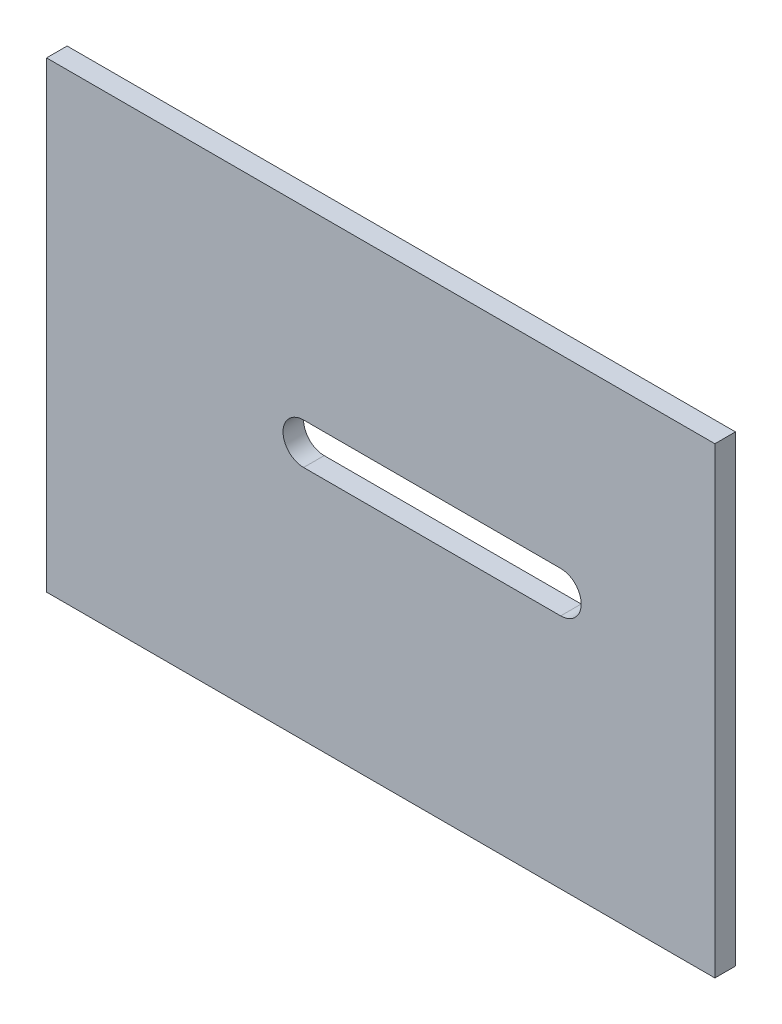
ISO-10303-21;
HEADER;
FILE_DESCRIPTION(('STEP AP214'),'2;1');
FILE_NAME('part.step','',(''),(''),'','','');
FILE_SCHEMA(('AUTOMOTIVE_DESIGN { 1 0 10303 214 1 1 1 1 }'));
ENDSEC;
DATA;
#1=APPLICATION_CONTEXT('core data for automotive mechanical design processes');
#2=APPLICATION_PROTOCOL_DEFINITION('international standard','automotive_design',2000,#1);
#3=PRODUCT_CONTEXT('',#1,'mechanical');
#4=PRODUCT('Part','Part','',(#3));
#5=PRODUCT_RELATED_PRODUCT_CATEGORY('part','',(#4));
#6=PRODUCT_DEFINITION_FORMATION('','',#4);
#7=PRODUCT_DEFINITION_CONTEXT('part definition',#1,'design');
#8=PRODUCT_DEFINITION('design','',#6,#7);
#9=PRODUCT_DEFINITION_SHAPE('','',#8);
#10=(LENGTH_UNIT() NAMED_UNIT(*) SI_UNIT(.MILLI.,.METRE.));
#11=(NAMED_UNIT(*) PLANE_ANGLE_UNIT() SI_UNIT($,.RADIAN.));
#12=(NAMED_UNIT(*) SI_UNIT($,.STERADIAN.) SOLID_ANGLE_UNIT());
#13=UNCERTAINTY_MEASURE_WITH_UNIT(LENGTH_MEASURE(1.E-05),#10,'distance_accuracy_value','');
#14=(GEOMETRIC_REPRESENTATION_CONTEXT(3) GLOBAL_UNCERTAINTY_ASSIGNED_CONTEXT((#13)) GLOBAL_UNIT_ASSIGNED_CONTEXT((#10,
#11,#12)) REPRESENTATION_CONTEXT('',''));
#15=CARTESIAN_POINT('',(0.,0.,0.));
#16=DIRECTION('',(0.,0.,1.));
#17=DIRECTION('',(1.,0.,0.));
#18=AXIS2_PLACEMENT_3D('',#15,#16,#17);
#19=CARTESIAN_POINT('',(0.,0.,2.));
#20=DIRECTION('',(0.,0.,1.));
#21=DIRECTION('',(1.,0.,0.));
#22=AXIS2_PLACEMENT_3D('',#19,#20,#21);
#23=PLANE('',#22);
#24=DIRECTION('',(0.,1.,0.));
#25=VECTOR('',#24,1.);
#26=CARTESIAN_POINT('',(32.5,22.5,2.));
#27=LINE('',#26,#25);
#28=CARTESIAN_POINT('',(32.5,-22.5,2.));
#29=VERTEX_POINT('',#28);
#30=CARTESIAN_POINT('',(32.5,22.5,2.));
#31=VERTEX_POINT('',#30);
#32=EDGE_CURVE('E135',#29,#31,#27,.T.);
#33=ORIENTED_EDGE('',*,*,#32,.T.);
#34=DIRECTION('',(-1.,0.,0.));
#35=VECTOR('',#34,1.);
#36=CARTESIAN_POINT('',(-32.5,22.5,2.));
#37=LINE('',#36,#35);
#38=CARTESIAN_POINT('',(-32.5,22.5,2.));
#39=VERTEX_POINT('',#38);
#40=EDGE_CURVE('E138',#31,#39,#37,.T.);
#41=ORIENTED_EDGE('',*,*,#40,.T.);
#42=DIRECTION('',(0.,-1.,0.));
#43=VECTOR('',#42,1.);
#44=CARTESIAN_POINT('',(-32.5,22.5,2.));
#45=LINE('',#44,#43);
#46=CARTESIAN_POINT('',(-32.5,-22.5,2.));
#47=VERTEX_POINT('',#46);
#48=EDGE_CURVE('E141',#39,#47,#45,.T.);
#49=ORIENTED_EDGE('',*,*,#48,.T.);
#50=DIRECTION('',(1.,0.,0.));
#51=VECTOR('',#50,1.);
#52=CARTESIAN_POINT('',(-32.5,-22.5,2.));
#53=LINE('',#52,#51);
#54=EDGE_CURVE('E143',#47,#29,#53,.T.);
#55=ORIENTED_EDGE('',*,*,#54,.T.);
#56=EDGE_LOOP('',(#33,#41,#49,#55));
#57=FACE_BOUND('',#56,.T.);
#58=DIRECTION('',(1.,0.,0.));
#59=VECTOR('',#58,1.);
#60=CARTESIAN_POINT('',(-7.50000000000001,0.500000000000002,2.));
#61=LINE('',#60,#59);
#62=CARTESIAN_POINT('',(-7.50000000000001,0.500000000000002,2.));
#63=VERTEX_POINT('',#62);
#64=CARTESIAN_POINT('',(17.5,0.500000000000002,2.));
#65=VERTEX_POINT('',#64);
#66=EDGE_CURVE('E107',#63,#65,#61,.T.);
#67=ORIENTED_EDGE('',*,*,#66,.F.);
#68=CARTESIAN_POINT('',(-7.50000000000001,2.5,2.));
#69=DIRECTION('',(0.,0.,1.));
#70=DIRECTION('',(1.,0.,0.));
#71=AXIS2_PLACEMENT_3D('',#68,#69,#70);
#72=CIRCLE('',#71,2.);
#73=CARTESIAN_POINT('',(-7.50000000000001,4.5,2.));
#74=VERTEX_POINT('',#73);
#75=EDGE_CURVE('E99',#74,#63,#72,.T.);
#76=ORIENTED_EDGE('',*,*,#75,.F.);
#77=DIRECTION('',(-1.,0.,0.));
#78=VECTOR('',#77,1.);
#79=CARTESIAN_POINT('',(-7.50000000000001,4.5,2.));
#80=LINE('',#79,#78);
#81=CARTESIAN_POINT('',(17.5,4.5,2.));
#82=VERTEX_POINT('',#81);
#83=EDGE_CURVE('E121',#82,#74,#80,.T.);
#84=ORIENTED_EDGE('',*,*,#83,.F.);
#85=CARTESIAN_POINT('',(17.5,2.5,2.));
#86=DIRECTION('',(0.,0.,1.));
#87=DIRECTION('',(1.,0.,0.));
#88=AXIS2_PLACEMENT_3D('',#85,#86,#87);
#89=CIRCLE('',#88,2.);
#90=EDGE_CURVE('E119',#65,#82,#89,.T.);
#91=ORIENTED_EDGE('',*,*,#90,.F.);
#92=EDGE_LOOP('',(#67,#76,#84,#91));
#93=FACE_BOUND('',#92,.T.);
#94=ADVANCED_FACE('F34',(#57,#93),#23,.T.);
#95=CARTESIAN_POINT('',(0.,0.,0.));
#96=DIRECTION('',(0.,0.,1.));
#97=DIRECTION('',(1.,0.,0.));
#98=AXIS2_PLACEMENT_3D('',#95,#96,#97);
#99=PLANE('',#98);
#100=DIRECTION('',(0.,1.,0.));
#101=VECTOR('',#100,1.);
#102=CARTESIAN_POINT('',(32.5,22.5,0.));
#103=LINE('',#102,#101);
#104=CARTESIAN_POINT('',(32.5,-22.5,0.));
#105=VERTEX_POINT('',#104);
#106=CARTESIAN_POINT('',(32.5,22.5,0.));
#107=VERTEX_POINT('',#106);
#108=EDGE_CURVE('E115',#105,#107,#103,.T.);
#109=ORIENTED_EDGE('',*,*,#108,.F.);
#110=DIRECTION('',(1.,0.,0.));
#111=VECTOR('',#110,1.);
#112=CARTESIAN_POINT('',(-32.5,-22.5,0.));
#113=LINE('',#112,#111);
#114=CARTESIAN_POINT('',(-32.5,-22.5,0.));
#115=VERTEX_POINT('',#114);
#116=EDGE_CURVE('E139',#115,#105,#113,.T.);
#117=ORIENTED_EDGE('',*,*,#116,.F.);
#118=DIRECTION('',(0.,-1.,0.));
#119=VECTOR('',#118,1.);
#120=CARTESIAN_POINT('',(-32.5,22.5,0.));
#121=LINE('',#120,#119);
#122=CARTESIAN_POINT('',(-32.5,22.5,0.));
#123=VERTEX_POINT('',#122);
#124=EDGE_CURVE('E150',#123,#115,#121,.T.);
#125=ORIENTED_EDGE('',*,*,#124,.F.);
#126=DIRECTION('',(-1.,0.,0.));
#127=VECTOR('',#126,1.);
#128=CARTESIAN_POINT('',(-32.5,22.5,0.));
#129=LINE('',#128,#127);
#130=EDGE_CURVE('E148',#107,#123,#129,.T.);
#131=ORIENTED_EDGE('',*,*,#130,.F.);
#132=EDGE_LOOP('',(#109,#117,#125,#131));
#133=FACE_BOUND('',#132,.T.);
#134=CARTESIAN_POINT('',(-7.50000000000001,2.5,0.));
#135=DIRECTION('',(0.,0.,1.));
#136=DIRECTION('',(1.,0.,0.));
#137=AXIS2_PLACEMENT_3D('',#134,#135,#136);
#138=CIRCLE('',#137,2.);
#139=CARTESIAN_POINT('',(-7.50000000000001,4.5,0.));
#140=VERTEX_POINT('',#139);
#141=CARTESIAN_POINT('',(-7.50000000000001,0.500000000000002,0.));
#142=VERTEX_POINT('',#141);
#143=EDGE_CURVE('E57',#140,#142,#138,.T.);
#144=ORIENTED_EDGE('',*,*,#143,.T.);
#145=DIRECTION('',(1.,0.,0.));
#146=VECTOR('',#145,1.);
#147=CARTESIAN_POINT('',(-7.50000000000001,0.500000000000002,0.));
#148=LINE('',#147,#146);
#149=CARTESIAN_POINT('',(17.5,0.500000000000002,0.));
#150=VERTEX_POINT('',#149);
#151=EDGE_CURVE('E114',#142,#150,#148,.T.);
#152=ORIENTED_EDGE('',*,*,#151,.T.);
#153=CARTESIAN_POINT('',(17.5,2.5,0.));
#154=DIRECTION('',(0.,0.,1.));
#155=DIRECTION('',(1.,0.,0.));
#156=AXIS2_PLACEMENT_3D('',#153,#154,#155);
#157=CIRCLE('',#156,2.);
#158=CARTESIAN_POINT('',(17.5,4.5,0.));
#159=VERTEX_POINT('',#158);
#160=EDGE_CURVE('E127',#150,#159,#157,.T.);
#161=ORIENTED_EDGE('',*,*,#160,.T.);
#162=DIRECTION('',(-1.,0.,0.));
#163=VECTOR('',#162,1.);
#164=CARTESIAN_POINT('',(-7.50000000000001,4.5,0.));
#165=LINE('',#164,#163);
#166=EDGE_CURVE('E108',#159,#140,#165,.T.);
#167=ORIENTED_EDGE('',*,*,#166,.T.);
#168=EDGE_LOOP('',(#144,#152,#161,#167));
#169=FACE_BOUND('',#168,.T.);
#170=ADVANCED_FACE('F168',(#133,#169),#99,.F.);
#171=CARTESIAN_POINT('',(32.5,22.5,2.));
#172=DIRECTION('',(-1.,0.,0.));
#173=DIRECTION('',(0.,0.,1.));
#174=AXIS2_PLACEMENT_3D('',#171,#172,#173);
#175=PLANE('',#174);
#176=ORIENTED_EDGE('',*,*,#108,.T.);
#177=DIRECTION('',(0.,0.,-1.));
#178=VECTOR('',#177,1.);
#179=CARTESIAN_POINT('',(32.5,22.5,2.));
#180=LINE('',#179,#178);
#181=EDGE_CURVE('E11',#31,#107,#180,.T.);
#182=ORIENTED_EDGE('',*,*,#181,.F.);
#183=ORIENTED_EDGE('',*,*,#32,.F.);
#184=DIRECTION('',(0.,0.,-1.));
#185=VECTOR('',#184,1.);
#186=CARTESIAN_POINT('',(32.5,-22.5,2.));
#187=LINE('',#186,#185);
#188=EDGE_CURVE('E145',#29,#105,#187,.T.);
#189=ORIENTED_EDGE('',*,*,#188,.T.);
#190=EDGE_LOOP('',(#176,#182,#183,#189));
#191=FACE_BOUND('',#190,.T.);
#192=ADVANCED_FACE('F36',(#191),#175,.F.);
#193=CARTESIAN_POINT('',(-32.5,22.5,2.));
#194=DIRECTION('',(0.,-1.,0.));
#195=DIRECTION('',(0.,0.,-1.));
#196=AXIS2_PLACEMENT_3D('',#193,#194,#195);
#197=PLANE('',#196);
#198=ORIENTED_EDGE('',*,*,#130,.T.);
#199=DIRECTION('',(0.,0.,-1.));
#200=VECTOR('',#199,1.);
#201=CARTESIAN_POINT('',(-32.5,22.5,2.));
#202=LINE('',#201,#200);
#203=EDGE_CURVE('E42',#39,#123,#202,.T.);
#204=ORIENTED_EDGE('',*,*,#203,.F.);
#205=ORIENTED_EDGE('',*,*,#40,.F.);
#206=ORIENTED_EDGE('',*,*,#181,.T.);
#207=EDGE_LOOP('',(#198,#204,#205,#206));
#208=FACE_BOUND('',#207,.T.);
#209=ADVANCED_FACE('F178',(#208),#197,.F.);
#210=CARTESIAN_POINT('',(-32.5,22.5,2.));
#211=DIRECTION('',(1.,0.,0.));
#212=DIRECTION('',(0.,1.,0.));
#213=AXIS2_PLACEMENT_3D('',#210,#211,#212);
#214=PLANE('',#213);
#215=ORIENTED_EDGE('',*,*,#124,.T.);
#216=DIRECTION('',(0.,0.,-1.));
#217=VECTOR('',#216,1.);
#218=CARTESIAN_POINT('',(-32.5,-22.5,2.));
#219=LINE('',#218,#217);
#220=EDGE_CURVE('E155',#47,#115,#219,.T.);
#221=ORIENTED_EDGE('',*,*,#220,.F.);
#222=ORIENTED_EDGE('',*,*,#48,.F.);
#223=ORIENTED_EDGE('',*,*,#203,.T.);
#224=EDGE_LOOP('',(#215,#221,#222,#223));
#225=FACE_BOUND('',#224,.T.);
#226=ADVANCED_FACE('F162',(#225),#214,.F.);
#227=CARTESIAN_POINT('',(-32.5,-22.5,2.));
#228=DIRECTION('',(0.,1.,0.));
#229=DIRECTION('',(0.,0.,1.));
#230=AXIS2_PLACEMENT_3D('',#227,#228,#229);
#231=PLANE('',#230);
#232=ORIENTED_EDGE('',*,*,#116,.T.);
#233=ORIENTED_EDGE('',*,*,#188,.F.);
#234=ORIENTED_EDGE('',*,*,#54,.F.);
#235=ORIENTED_EDGE('',*,*,#220,.T.);
#236=EDGE_LOOP('',(#232,#233,#234,#235));
#237=FACE_BOUND('',#236,.T.);
#238=ADVANCED_FACE('F172',(#237),#231,.F.);
#239=CARTESIAN_POINT('',(-7.50000000000001,2.5,2.));
#240=DIRECTION('',(0.,0.,-1.));
#241=DIRECTION('',(-1.,0.,0.));
#242=AXIS2_PLACEMENT_3D('',#239,#240,#241);
#243=CYLINDRICAL_SURFACE('',#242,2.);
#244=ORIENTED_EDGE('',*,*,#143,.F.);
#245=DIRECTION('',(0.,0.,-1.));
#246=VECTOR('',#245,1.);
#247=CARTESIAN_POINT('',(-7.50000000000001,4.5,2.));
#248=LINE('',#247,#246);
#249=EDGE_CURVE('E103',#74,#140,#248,.T.);
#250=ORIENTED_EDGE('',*,*,#249,.F.);
#251=ORIENTED_EDGE('',*,*,#75,.T.);
#252=DIRECTION('',(0.,0.,-1.));
#253=VECTOR('',#252,1.);
#254=CARTESIAN_POINT('',(-7.50000000000001,0.500000000000002,2.));
#255=LINE('',#254,#253);
#256=EDGE_CURVE('E102',#63,#142,#255,.T.);
#257=ORIENTED_EDGE('',*,*,#256,.T.);
#258=EDGE_LOOP('',(#244,#250,#251,#257));
#259=FACE_BOUND('',#258,.T.);
#260=ADVANCED_FACE('F101',(#259),#243,.F.);
#261=CARTESIAN_POINT('',(-7.50000000000001,0.500000000000002,2.));
#262=DIRECTION('',(0.,1.,0.));
#263=DIRECTION('',(0.,0.,1.));
#264=AXIS2_PLACEMENT_3D('',#261,#262,#263);
#265=PLANE('',#264);
#266=ORIENTED_EDGE('',*,*,#151,.F.);
#267=ORIENTED_EDGE('',*,*,#256,.F.);
#268=ORIENTED_EDGE('',*,*,#66,.T.);
#269=DIRECTION('',(0.,0.,-1.));
#270=VECTOR('',#269,1.);
#271=CARTESIAN_POINT('',(17.5,0.500000000000002,2.));
#272=LINE('',#271,#270);
#273=EDGE_CURVE('E116',#65,#150,#272,.T.);
#274=ORIENTED_EDGE('',*,*,#273,.T.);
#275=EDGE_LOOP('',(#266,#267,#268,#274));
#276=FACE_BOUND('',#275,.T.);
#277=ADVANCED_FACE('F111',(#276),#265,.T.);
#278=CARTESIAN_POINT('',(17.5,2.5,2.));
#279=DIRECTION('',(0.,0.,-1.));
#280=DIRECTION('',(-1.,0.,0.));
#281=AXIS2_PLACEMENT_3D('',#278,#279,#280);
#282=CYLINDRICAL_SURFACE('',#281,2.);
#283=ORIENTED_EDGE('',*,*,#160,.F.);
#284=ORIENTED_EDGE('',*,*,#273,.F.);
#285=ORIENTED_EDGE('',*,*,#90,.T.);
#286=DIRECTION('',(0.,0.,-1.));
#287=VECTOR('',#286,1.);
#288=CARTESIAN_POINT('',(17.5,4.5,2.));
#289=LINE('',#288,#287);
#290=EDGE_CURVE('E49',#82,#159,#289,.T.);
#291=ORIENTED_EDGE('',*,*,#290,.T.);
#292=EDGE_LOOP('',(#283,#284,#285,#291));
#293=FACE_BOUND('',#292,.T.);
#294=ADVANCED_FACE('F201',(#293),#282,.F.);
#295=CARTESIAN_POINT('',(-7.50000000000001,4.5,2.));
#296=DIRECTION('',(0.,-1.,0.));
#297=DIRECTION('',(0.,0.,-1.));
#298=AXIS2_PLACEMENT_3D('',#295,#296,#297);
#299=PLANE('',#298);
#300=ORIENTED_EDGE('',*,*,#166,.F.);
#301=ORIENTED_EDGE('',*,*,#290,.F.);
#302=ORIENTED_EDGE('',*,*,#83,.T.);
#303=ORIENTED_EDGE('',*,*,#249,.T.);
#304=EDGE_LOOP('',(#300,#301,#302,#303));
#305=FACE_BOUND('',#304,.T.);
#306=ADVANCED_FACE('F205',(#305),#299,.T.);
#307=CLOSED_SHELL('',(#94,#170,#192,#209,#226,#238,#260,#277,#294,#306));
#308=MANIFOLD_SOLID_BREP('B2',#307);
#309=ADVANCED_BREP_SHAPE_REPRESENTATION('',(#18,#308),#14);
#310=SHAPE_DEFINITION_REPRESENTATION(#9,#309);
ENDSEC;
END-ISO-10303-21;
